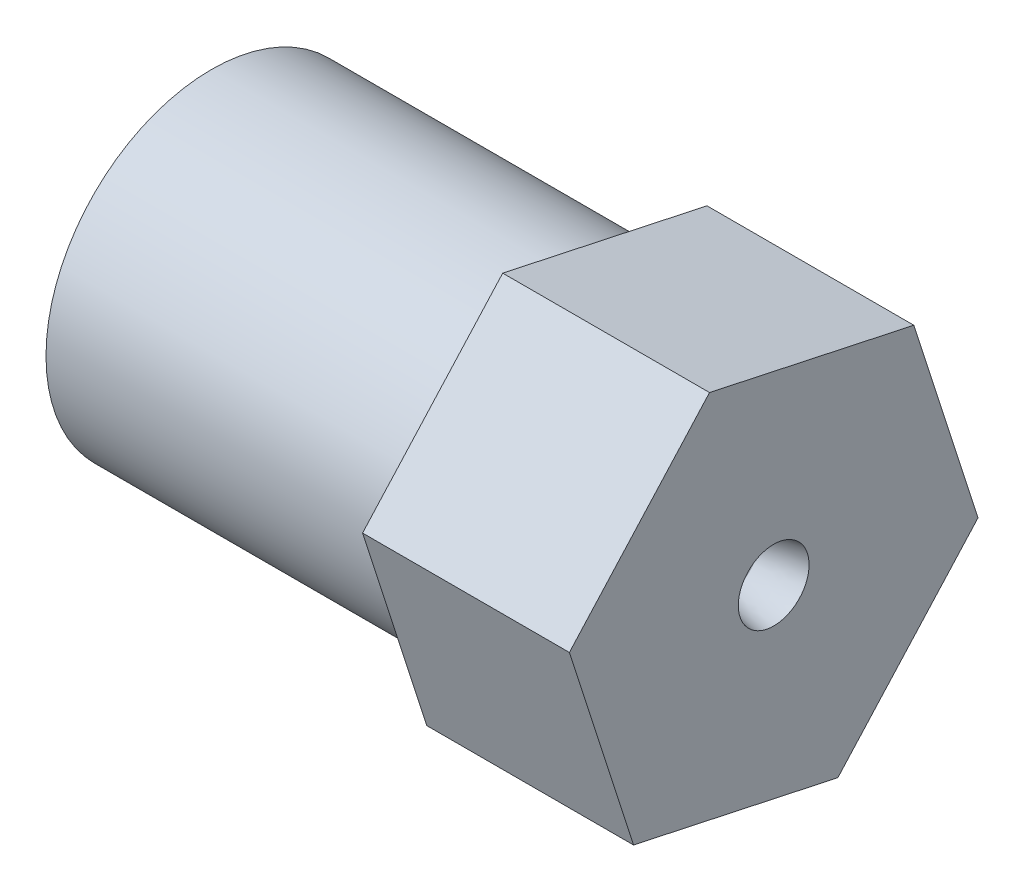
ISO-10303-21;
HEADER;
FILE_DESCRIPTION(('STEP AP214'),'2;1');
FILE_NAME('part.step','',(''),(''),'','','');
FILE_SCHEMA(('AUTOMOTIVE_DESIGN { 1 0 10303 214 1 1 1 1 }'));
ENDSEC;
DATA;
#1=APPLICATION_CONTEXT('core data for automotive mechanical design processes');
#2=APPLICATION_PROTOCOL_DEFINITION('international standard','automotive_design',2000,#1);
#3=PRODUCT_CONTEXT('',#1,'mechanical');
#4=PRODUCT('Part','Part','',(#3));
#5=PRODUCT_RELATED_PRODUCT_CATEGORY('part','',(#4));
#6=PRODUCT_DEFINITION_FORMATION('','',#4);
#7=PRODUCT_DEFINITION_CONTEXT('part definition',#1,'design');
#8=PRODUCT_DEFINITION('design','',#6,#7);
#9=PRODUCT_DEFINITION_SHAPE('','',#8);
#10=(LENGTH_UNIT() NAMED_UNIT(*) SI_UNIT(.MILLI.,.METRE.));
#11=(NAMED_UNIT(*) PLANE_ANGLE_UNIT() SI_UNIT($,.RADIAN.));
#12=(NAMED_UNIT(*) SI_UNIT($,.STERADIAN.) SOLID_ANGLE_UNIT());
#13=UNCERTAINTY_MEASURE_WITH_UNIT(LENGTH_MEASURE(1.E-05),#10,'distance_accuracy_value','');
#14=(GEOMETRIC_REPRESENTATION_CONTEXT(3) GLOBAL_UNCERTAINTY_ASSIGNED_CONTEXT((#13)) GLOBAL_UNIT_ASSIGNED_CONTEXT((#10,
#11,#12)) REPRESENTATION_CONTEXT('',''));
#15=CARTESIAN_POINT('',(0.,0.,0.));
#16=DIRECTION('',(0.,0.,1.));
#17=DIRECTION('',(1.,0.,0.));
#18=AXIS2_PLACEMENT_3D('',#15,#16,#17);
#19=CARTESIAN_POINT('',(0.,0.,0.));
#20=DIRECTION('',(-1.,0.,0.));
#21=DIRECTION('',(0.,0.,1.));
#22=AXIS2_PLACEMENT_3D('',#19,#20,#21);
#23=CYLINDRICAL_SURFACE('',#22,10.16);
#24=CARTESIAN_POINT('',(-10.5601197960547,0.,0.));
#25=DIRECTION('',(1.,0.,0.));
#26=DIRECTION('',(0.,0.,-1.));
#27=AXIS2_PLACEMENT_3D('',#24,#25,#26);
#28=CIRCLE('',#27,10.16);
#29=CARTESIAN_POINT('',(-10.5601197960547,0.,-10.16));
#30=VERTEX_POINT('',#29);
#31=EDGE_CURVE('E11',#30,#30,#28,.F.);
#32=ORIENTED_EDGE('',*,*,#31,.T.);
#33=EDGE_LOOP('',(#32));
#34=FACE_BOUND('',#33,.T.);
#35=CARTESIAN_POINT('',(-31.75,0.,0.));
#36=DIRECTION('',(-1.,0.,0.));
#37=DIRECTION('',(0.,0.,1.));
#38=AXIS2_PLACEMENT_3D('',#35,#36,#37);
#39=CIRCLE('',#38,10.16);
#40=CARTESIAN_POINT('',(-31.75,0.,10.16));
#41=VERTEX_POINT('',#40);
#42=EDGE_CURVE('E227',#41,#41,#39,.T.);
#43=ORIENTED_EDGE('',*,*,#42,.F.);
#44=EDGE_LOOP('',(#43));
#45=FACE_BOUND('',#44,.T.);
#46=ADVANCED_FACE('F39',(#34,#45),#23,.T.);
#47=CARTESIAN_POINT('',(0.,0.,0.));
#48=DIRECTION('',(-1.,0.,0.));
#49=DIRECTION('',(0.,0.,1.));
#50=AXIS2_PLACEMENT_3D('',#47,#48,#49);
#51=TOROIDAL_SURFACE('',#50,3.75,2.25);
#52=CARTESIAN_POINT('',(0.,0.,0.));
#53=DIRECTION('',(-1.,0.,0.));
#54=DIRECTION('',(0.,0.,1.));
#55=AXIS2_PLACEMENT_3D('',#52,#53,#54);
#56=CIRCLE('',#55,1.49999999991984);
#57=CARTESIAN_POINT('',(0.,0.,1.49999999991984));
#58=VERTEX_POINT('',#57);
#59=EDGE_CURVE('E179',#58,#58,#56,.T.);
#60=ORIENTED_EDGE('',*,*,#59,.F.);
#61=EDGE_LOOP('',(#60));
#62=FACE_BOUND('',#61,.T.);
#63=CARTESIAN_POINT('',(-1.59099025766971,0.,0.));
#64=DIRECTION('',(-1.,0.,0.));
#65=DIRECTION('',(0.,0.,1.));
#66=AXIS2_PLACEMENT_3D('',#63,#64,#65);
#67=CIRCLE('',#66,2.15900974233025);
#68=CARTESIAN_POINT('',(-1.59099025766971,0.,2.15900974233025));
#69=VERTEX_POINT('',#68);
#70=EDGE_CURVE('E144',#69,#69,#67,.T.);
#71=ORIENTED_EDGE('',*,*,#70,.T.);
#72=EDGE_LOOP('',(#71));
#73=FACE_BOUND('',#72,.T.);
#74=ADVANCED_FACE('F168',(#62,#73),#51,.T.);
#75=CARTESIAN_POINT('',(0.,0.,0.));
#76=DIRECTION('',(-1.,0.,0.));
#77=DIRECTION('',(0.,0.,1.));
#78=AXIS2_PLACEMENT_3D('',#75,#76,#77);
#79=TOROIDAL_SURFACE('',#78,2.1,0.600000000080161);
#80=CARTESIAN_POINT('',(0.205212086614726,0.,0.));
#81=DIRECTION('',(-1.,0.,0.));
#82=DIRECTION('',(0.,0.,1.));
#83=AXIS2_PLACEMENT_3D('',#80,#81,#82);
#84=CIRCLE('',#83,1.5361844276443);
#85=CARTESIAN_POINT('',(0.205212086614726,0.,1.5361844276443));
#86=VERTEX_POINT('',#85);
#87=EDGE_CURVE('E233',#86,#86,#84,.T.);
#88=ORIENTED_EDGE('',*,*,#87,.F.);
#89=EDGE_LOOP('',(#88));
#90=FACE_BOUND('',#89,.T.);
#91=ORIENTED_EDGE('',*,*,#59,.T.);
#92=EDGE_LOOP('',(#91));
#93=FACE_BOUND('',#92,.T.);
#94=ADVANCED_FACE('F164',(#90,#93),#79,.T.);
#95=CARTESIAN_POINT('',(337343.343526131,-941393.375211265,0.));
#96=CARTESIAN_POINT('',(-342019.938120508,939694.156967815,0.));
#97=CARTESIAN_POINT('',(346697.353563229,-937988.793986656,0.));
#98=B_SPLINE_CURVE_WITH_KNOTS('',2,(#95,#96,#97),.UNSPECIFIED.,.F.,.F.,(3,3),(0.,1.),.UNSPECIFIED.);
#99=CARTESIAN_POINT('',(0.,0.,0.));
#100=DIRECTION('',(-1.,0.,0.));
#101=AXIS1_PLACEMENT('',#99,#100);
#102=SURFACE_OF_REVOLUTION('',#98,#101);
#103=CARTESIAN_POINT('',(2.77488020377942,0.,0.));
#104=DIRECTION('',(-1.,0.,0.));
#105=DIRECTION('',(0.,0.,1.));
#106=AXIS2_PLACEMENT_3D('',#103,#104,#105);
#107=CIRCLE('',#106,2.17370651192842);
#108=CARTESIAN_POINT('',(2.77488020377942,0.,2.17370651192842));
#109=VERTEX_POINT('',#108);
#110=EDGE_CURVE('E230',#109,#109,#107,.T.);
#111=ORIENTED_EDGE('',*,*,#110,.F.);
#112=EDGE_LOOP('',(#111));
#113=FACE_BOUND('',#112,.T.);
#114=ORIENTED_EDGE('',*,*,#87,.T.);
#115=EDGE_LOOP('',(#114));
#116=FACE_BOUND('',#115,.T.);
#117=ADVANCED_FACE('F159',(#113,#116),#102,.T.);
#118=CARTESIAN_POINT('',(2.7748802039453,10.16,0.));
#119=DIRECTION('',(-1.,0.,0.));
#120=DIRECTION('',(0.,0.,1.));
#121=AXIS2_PLACEMENT_3D('',#118,#119,#120);
#122=PLANE('',#121);
#123=ORIENTED_EDGE('',*,*,#110,.T.);
#124=EDGE_LOOP('',(#123));
#125=FACE_BOUND('',#124,.T.);
#126=DIRECTION('',(0.,-0.951681663898051,-0.307086324345838));
#127=VECTOR('',#126,1.);
#128=CARTESIAN_POINT('',(2.7748802039453,-3.41249677929312,10.5755624900671));
#129=LINE('',#128,#127);
#130=CARTESIAN_POINT('',(2.7748802039453,2.69330707117882,12.5457684242007));
#131=VERTEX_POINT('',#130);
#132=CARTESIAN_POINT('',(2.7748802039453,-9.51830062976507,8.60535655593348));
#133=VERTEX_POINT('',#132);
#134=EDGE_CURVE('E127',#131,#133,#129,.T.);
#135=ORIENTED_EDGE('',*,*,#134,.T.);
#136=DIRECTION('',(0.,-0.209896273910742,-0.977723659424475));
#137=VECTOR('',#136,1.);
#138=CARTESIAN_POINT('',(2.7748802039453,-10.8649541653545,2.33247234383312));
#139=LINE('',#138,#137);
#140=CARTESIAN_POINT('',(2.7748802039453,-12.2116077009439,-3.94041186826723));
#141=VERTEX_POINT('',#140);
#142=EDGE_CURVE('E130',#133,#141,#139,.T.);
#143=ORIENTED_EDGE('',*,*,#142,.T.);
#144=DIRECTION('',(0.,0.741785389987309,-0.670637335078637));
#145=VECTOR('',#144,1.);
#146=CARTESIAN_POINT('',(2.7748802039453,-7.45245738606136,-8.24309014623397));
#147=LINE('',#146,#145);
#148=CARTESIAN_POINT('',(2.7748802039453,-2.69330707117882,-12.5457684242007));
#149=VERTEX_POINT('',#148);
#150=EDGE_CURVE('E133',#141,#149,#147,.T.);
#151=ORIENTED_EDGE('',*,*,#150,.T.);
#152=DIRECTION('',(0.,0.951681663898051,0.307086324345838));
#153=VECTOR('',#152,1.);
#154=CARTESIAN_POINT('',(2.7748802039453,3.41249677929312,-10.5755624900671));
#155=LINE('',#154,#153);
#156=CARTESIAN_POINT('',(2.7748802039453,9.51830062976506,-8.60535655593348));
#157=VERTEX_POINT('',#156);
#158=EDGE_CURVE('E136',#149,#157,#155,.T.);
#159=ORIENTED_EDGE('',*,*,#158,.T.);
#160=DIRECTION('',(0.,0.209896273910742,0.977723659424475));
#161=VECTOR('',#160,1.);
#162=CARTESIAN_POINT('',(2.7748802039453,10.8649541653545,-2.33247234383312));
#163=LINE('',#162,#161);
#164=CARTESIAN_POINT('',(2.7748802039453,12.2116077009439,3.94041186826724));
#165=VERTEX_POINT('',#164);
#166=EDGE_CURVE('E104',#157,#165,#163,.T.);
#167=ORIENTED_EDGE('',*,*,#166,.T.);
#168=DIRECTION('',(0.,-0.741785389987309,0.670637335078637));
#169=VECTOR('',#168,1.);
#170=CARTESIAN_POINT('',(2.7748802039453,7.45245738606136,8.24309014623397));
#171=LINE('',#170,#169);
#172=EDGE_CURVE('E139',#165,#131,#171,.T.);
#173=ORIENTED_EDGE('',*,*,#172,.T.);
#174=EDGE_LOOP('',(#135,#143,#151,#159,#167,#173));
#175=FACE_BOUND('',#174,.T.);
#176=ADVANCED_FACE('F163',(#125,#175),#122,.F.);
#177=CARTESIAN_POINT('',(-31.75,10.16,0.));
#178=DIRECTION('',(1.,0.,0.));
#179=DIRECTION('',(0.,0.,-1.));
#180=AXIS2_PLACEMENT_3D('',#177,#178,#179);
#181=PLANE('',#180);
#182=CARTESIAN_POINT('',(-31.75,0.,0.));
#183=DIRECTION('',(-1.,0.,0.));
#184=DIRECTION('',(0.,0.,1.));
#185=AXIS2_PLACEMENT_3D('',#182,#183,#184);
#186=CIRCLE('',#185,8.6614);
#187=CARTESIAN_POINT('',(-31.75,0.,8.6614));
#188=VERTEX_POINT('',#187);
#189=EDGE_CURVE('E224',#188,#188,#186,.T.);
#190=ORIENTED_EDGE('',*,*,#189,.F.);
#191=EDGE_LOOP('',(#190));
#192=FACE_BOUND('',#191,.T.);
#193=ORIENTED_EDGE('',*,*,#42,.T.);
#194=EDGE_LOOP('',(#193));
#195=FACE_BOUND('',#194,.T.);
#196=ADVANCED_FACE('F251',(#192,#195),#181,.F.);
#197=CARTESIAN_POINT('',(-31.115,0.,0.));
#198=DIRECTION('',(-1.,0.,0.));
#199=DIRECTION('',(0.,0.,1.));
#200=AXIS2_PLACEMENT_3D('',#197,#198,#199);
#201=TOROIDAL_SURFACE('',#200,8.6614,0.635);
#202=CARTESIAN_POINT('',(-31.115,0.,0.));
#203=DIRECTION('',(-1.,0.,0.));
#204=DIRECTION('',(0.,0.,1.));
#205=AXIS2_PLACEMENT_3D('',#202,#203,#204);
#206=CIRCLE('',#205,8.02639999999999);
#207=CARTESIAN_POINT('',(-31.115,0.,8.02639999999999));
#208=VERTEX_POINT('',#207);
#209=EDGE_CURVE('E221',#208,#208,#206,.T.);
#210=ORIENTED_EDGE('',*,*,#209,.F.);
#211=EDGE_LOOP('',(#210));
#212=FACE_BOUND('',#211,.T.);
#213=ORIENTED_EDGE('',*,*,#189,.T.);
#214=EDGE_LOOP('',(#213));
#215=FACE_BOUND('',#214,.T.);
#216=ADVANCED_FACE('F253',(#212,#215),#201,.T.);
#217=CARTESIAN_POINT('',(0.,0.,0.));
#218=DIRECTION('',(-1.,0.,0.));
#219=DIRECTION('',(0.,0.,1.));
#220=AXIS2_PLACEMENT_3D('',#217,#218,#219);
#221=CYLINDRICAL_SURFACE('',#220,8.02639999999999);
#222=CARTESIAN_POINT('',(-25.019,0.,0.));
#223=DIRECTION('',(-1.,0.,0.));
#224=DIRECTION('',(0.,0.,1.));
#225=AXIS2_PLACEMENT_3D('',#222,#223,#224);
#226=CIRCLE('',#225,8.02639999999999);
#227=CARTESIAN_POINT('',(-25.019,0.,8.02639999999999));
#228=VERTEX_POINT('',#227);
#229=EDGE_CURVE('E218',#228,#228,#226,.T.);
#230=ORIENTED_EDGE('',*,*,#229,.F.);
#231=EDGE_LOOP('',(#230));
#232=FACE_BOUND('',#231,.T.);
#233=ORIENTED_EDGE('',*,*,#209,.T.);
#234=EDGE_LOOP('',(#233));
#235=FACE_BOUND('',#234,.T.);
#236=ADVANCED_FACE('F260',(#232,#235),#221,.F.);
#237=CARTESIAN_POINT('',(-25.019,0.,0.));
#238=DIRECTION('',(-1.,0.,0.));
#239=DIRECTION('',(0.,0.,1.));
#240=AXIS2_PLACEMENT_3D('',#237,#238,#239);
#241=TOROIDAL_SURFACE('',#240,7.89939999999999,0.127);
#242=CARTESIAN_POINT('',(-24.892,0.,0.));
#243=DIRECTION('',(-1.,0.,0.));
#244=DIRECTION('',(0.,0.,1.));
#245=AXIS2_PLACEMENT_3D('',#242,#243,#244);
#246=CIRCLE('',#245,7.89939999999999);
#247=CARTESIAN_POINT('',(-24.892,0.,7.89939999999999));
#248=VERTEX_POINT('',#247);
#249=EDGE_CURVE('E215',#248,#248,#246,.T.);
#250=ORIENTED_EDGE('',*,*,#249,.F.);
#251=EDGE_LOOP('',(#250));
#252=FACE_BOUND('',#251,.T.);
#253=ORIENTED_EDGE('',*,*,#229,.T.);
#254=EDGE_LOOP('',(#253));
#255=FACE_BOUND('',#254,.T.);
#256=ADVANCED_FACE('F268',(#252,#255),#241,.F.);
#257=CARTESIAN_POINT('',(-24.892,6.9469,0.));
#258=DIRECTION('',(1.,0.,0.));
#259=DIRECTION('',(0.,0.,-1.));
#260=AXIS2_PLACEMENT_3D('',#257,#258,#259);
#261=PLANE('',#260);
#262=CARTESIAN_POINT('',(-24.892,0.,0.));
#263=DIRECTION('',(-1.,0.,0.));
#264=DIRECTION('',(0.,0.,1.));
#265=AXIS2_PLACEMENT_3D('',#262,#263,#264);
#266=CIRCLE('',#265,6.9469);
#267=CARTESIAN_POINT('',(-24.892,0.,6.9469));
#268=VERTEX_POINT('',#267);
#269=EDGE_CURVE('E212',#268,#268,#266,.T.);
#270=ORIENTED_EDGE('',*,*,#269,.F.);
#271=EDGE_LOOP('',(#270));
#272=FACE_BOUND('',#271,.T.);
#273=ORIENTED_EDGE('',*,*,#249,.T.);
#274=EDGE_LOOP('',(#273));
#275=FACE_BOUND('',#274,.T.);
#276=ADVANCED_FACE('F272',(#272,#275),#261,.F.);
#277=CARTESIAN_POINT('',(0.,0.,0.));
#278=DIRECTION('',(-1.,0.,0.));
#279=DIRECTION('',(0.,0.,1.));
#280=AXIS2_PLACEMENT_3D('',#277,#278,#279);
#281=CYLINDRICAL_SURFACE('',#280,6.9469);
#282=CARTESIAN_POINT('',(-20.066,0.,0.));
#283=DIRECTION('',(-1.,0.,0.));
#284=DIRECTION('',(0.,0.,1.));
#285=AXIS2_PLACEMENT_3D('',#282,#283,#284);
#286=CIRCLE('',#285,6.9469);
#287=CARTESIAN_POINT('',(-20.066,0.,6.9469));
#288=VERTEX_POINT('',#287);
#289=EDGE_CURVE('E209',#288,#288,#286,.T.);
#290=ORIENTED_EDGE('',*,*,#289,.F.);
#291=EDGE_LOOP('',(#290));
#292=FACE_BOUND('',#291,.T.);
#293=ORIENTED_EDGE('',*,*,#269,.T.);
#294=EDGE_LOOP('',(#293));
#295=FACE_BOUND('',#294,.T.);
#296=ADVANCED_FACE('F276',(#292,#295),#281,.F.);
#297=CARTESIAN_POINT('',(-20.066,0.,0.));
#298=DIRECTION('',(-1.,0.,0.));
#299=DIRECTION('',(0.,0.,1.));
#300=AXIS2_PLACEMENT_3D('',#297,#298,#299);
#301=TOROIDAL_SURFACE('',#300,6.8199,0.127);
#302=CARTESIAN_POINT('',(-19.939,0.,0.));
#303=DIRECTION('',(-1.,0.,0.));
#304=DIRECTION('',(0.,0.,1.));
#305=AXIS2_PLACEMENT_3D('',#302,#303,#304);
#306=CIRCLE('',#305,6.8199);
#307=CARTESIAN_POINT('',(-19.939,0.,6.8199));
#308=VERTEX_POINT('',#307);
#309=EDGE_CURVE('E206',#308,#308,#306,.T.);
#310=ORIENTED_EDGE('',*,*,#309,.F.);
#311=EDGE_LOOP('',(#310));
#312=FACE_BOUND('',#311,.T.);
#313=ORIENTED_EDGE('',*,*,#289,.T.);
#314=EDGE_LOOP('',(#313));
#315=FACE_BOUND('',#314,.T.);
#316=ADVANCED_FACE('F280',(#312,#315),#301,.F.);
#317=CARTESIAN_POINT('',(-19.939,5.46100000000001,0.));
#318=DIRECTION('',(1.,0.,0.));
#319=DIRECTION('',(0.,0.,-1.));
#320=AXIS2_PLACEMENT_3D('',#317,#318,#319);
#321=PLANE('',#320);
#322=CARTESIAN_POINT('',(-19.939,0.,0.));
#323=DIRECTION('',(-1.,0.,0.));
#324=DIRECTION('',(0.,0.,1.));
#325=AXIS2_PLACEMENT_3D('',#322,#323,#324);
#326=CIRCLE('',#325,5.46100000000001);
#327=CARTESIAN_POINT('',(-19.939,0.,5.46100000000001));
#328=VERTEX_POINT('',#327);
#329=EDGE_CURVE('E203',#328,#328,#326,.T.);
#330=ORIENTED_EDGE('',*,*,#329,.F.);
#331=EDGE_LOOP('',(#330));
#332=FACE_BOUND('',#331,.T.);
#333=ORIENTED_EDGE('',*,*,#309,.T.);
#334=EDGE_LOOP('',(#333));
#335=FACE_BOUND('',#334,.T.);
#336=ADVANCED_FACE('F284',(#332,#335),#321,.F.);
#337=CARTESIAN_POINT('',(-19.304,0.,0.));
#338=DIRECTION('',(-1.,0.,0.));
#339=DIRECTION('',(0.,0.,1.));
#340=AXIS2_PLACEMENT_3D('',#337,#338,#339);
#341=TOROIDAL_SURFACE('',#340,5.461,0.635);
#342=CARTESIAN_POINT('',(-19.304,0.,0.));
#343=DIRECTION('',(-1.,0.,0.));
#344=DIRECTION('',(0.,0.,1.));
#345=AXIS2_PLACEMENT_3D('',#342,#343,#344);
#346=CIRCLE('',#345,4.826);
#347=CARTESIAN_POINT('',(-19.304,0.,4.826));
#348=VERTEX_POINT('',#347);
#349=EDGE_CURVE('E200',#348,#348,#346,.T.);
#350=ORIENTED_EDGE('',*,*,#349,.F.);
#351=EDGE_LOOP('',(#350));
#352=FACE_BOUND('',#351,.T.);
#353=ORIENTED_EDGE('',*,*,#329,.T.);
#354=EDGE_LOOP('',(#353));
#355=FACE_BOUND('',#354,.T.);
#356=ADVANCED_FACE('F288',(#352,#355),#341,.T.);
#357=CARTESIAN_POINT('',(0.,0.,0.));
#358=DIRECTION('',(-1.,0.,0.));
#359=DIRECTION('',(0.,0.,1.));
#360=AXIS2_PLACEMENT_3D('',#357,#358,#359);
#361=CYLINDRICAL_SURFACE('',#360,4.826);
#362=CARTESIAN_POINT('',(-13.589,0.,0.));
#363=DIRECTION('',(-1.,0.,0.));
#364=DIRECTION('',(0.,0.,1.));
#365=AXIS2_PLACEMENT_3D('',#362,#363,#364);
#366=CIRCLE('',#365,4.826);
#367=CARTESIAN_POINT('',(-13.589,0.,4.826));
#368=VERTEX_POINT('',#367);
#369=EDGE_CURVE('E197',#368,#368,#366,.T.);
#370=ORIENTED_EDGE('',*,*,#369,.F.);
#371=EDGE_LOOP('',(#370));
#372=FACE_BOUND('',#371,.T.);
#373=ORIENTED_EDGE('',*,*,#349,.T.);
#374=EDGE_LOOP('',(#373));
#375=FACE_BOUND('',#374,.T.);
#376=ADVANCED_FACE('F292',(#372,#375),#361,.F.);
#377=CARTESIAN_POINT('',(-13.589,0.,0.));
#378=DIRECTION('',(-1.,0.,0.));
#379=DIRECTION('',(0.,0.,1.));
#380=AXIS2_PLACEMENT_3D('',#377,#378,#379);
#381=TOROIDAL_SURFACE('',#380,4.699,0.127);
#382=CARTESIAN_POINT('',(-13.462,0.,0.));
#383=DIRECTION('',(-1.,0.,0.));
#384=DIRECTION('',(0.,0.,1.));
#385=AXIS2_PLACEMENT_3D('',#382,#383,#384);
#386=CIRCLE('',#385,4.699);
#387=CARTESIAN_POINT('',(-13.462,0.,4.699));
#388=VERTEX_POINT('',#387);
#389=EDGE_CURVE('E194',#388,#388,#386,.T.);
#390=ORIENTED_EDGE('',*,*,#389,.F.);
#391=EDGE_LOOP('',(#390));
#392=FACE_BOUND('',#391,.T.);
#393=ORIENTED_EDGE('',*,*,#369,.T.);
#394=EDGE_LOOP('',(#393));
#395=FACE_BOUND('',#394,.T.);
#396=ADVANCED_FACE('F296',(#392,#395),#381,.F.);
#397=CARTESIAN_POINT('',(-13.462,4.445,0.));
#398=DIRECTION('',(1.,0.,0.));
#399=DIRECTION('',(0.,0.,-1.));
#400=AXIS2_PLACEMENT_3D('',#397,#398,#399);
#401=PLANE('',#400);
#402=CARTESIAN_POINT('',(-13.462,0.,0.));
#403=DIRECTION('',(-1.,0.,0.));
#404=DIRECTION('',(0.,0.,1.));
#405=AXIS2_PLACEMENT_3D('',#402,#403,#404);
#406=CIRCLE('',#405,4.445);
#407=CARTESIAN_POINT('',(-13.462,0.,4.445));
#408=VERTEX_POINT('',#407);
#409=EDGE_CURVE('E189',#408,#408,#406,.T.);
#410=ORIENTED_EDGE('',*,*,#409,.F.);
#411=EDGE_LOOP('',(#410));
#412=FACE_BOUND('',#411,.T.);
#413=ORIENTED_EDGE('',*,*,#389,.T.);
#414=EDGE_LOOP('',(#413));
#415=FACE_BOUND('',#414,.T.);
#416=ADVANCED_FACE('F300',(#412,#415),#401,.F.);
#417=CARTESIAN_POINT('',(0.,0.,0.));
#418=DIRECTION('',(-1.,0.,0.));
#419=DIRECTION('',(0.,0.,1.));
#420=AXIS2_PLACEMENT_3D('',#417,#418,#419);
#421=CYLINDRICAL_SURFACE('',#420,4.445);
#422=CARTESIAN_POINT('',(-5.19210857587407,0.,0.));
#423=DIRECTION('',(-1.,0.,0.));
#424=DIRECTION('',(0.,0.,1.));
#425=AXIS2_PLACEMENT_3D('',#422,#423,#424);
#426=CIRCLE('',#425,4.445);
#427=CARTESIAN_POINT('',(-5.19210857587407,0.,4.445));
#428=VERTEX_POINT('',#427);
#429=EDGE_CURVE('E185',#428,#428,#426,.T.);
#430=ORIENTED_EDGE('',*,*,#429,.F.);
#431=EDGE_LOOP('',(#430));
#432=FACE_BOUND('',#431,.T.);
#433=ORIENTED_EDGE('',*,*,#409,.T.);
#434=EDGE_LOOP('',(#433));
#435=FACE_BOUND('',#434,.T.);
#436=ADVANCED_FACE('F304',(#432,#435),#421,.F.);
#437=CARTESIAN_POINT('',(-5.19210857587407,0.,0.));
#438=DIRECTION('',(-1.,0.,0.));
#439=DIRECTION('',(0.,0.,1.));
#440=AXIS2_PLACEMENT_3D('',#437,#438,#439);
#441=DEGENERATE_TOROIDAL_SURFACE('',#440,1.27,3.175,.T.);
#442=CARTESIAN_POINT('',(-2.94704454560681,0.,0.));
#443=DIRECTION('',(-1.,0.,0.));
#444=DIRECTION('',(0.,0.,1.));
#445=AXIS2_PLACEMENT_3D('',#442,#443,#444);
#446=CIRCLE('',#445,3.51506403026731);
#447=CARTESIAN_POINT('',(-2.94704454560681,0.,3.51506403026731));
#448=VERTEX_POINT('',#447);
#449=EDGE_CURVE('E183',#448,#448,#446,.T.);
#450=ORIENTED_EDGE('',*,*,#449,.F.);
#451=EDGE_LOOP('',(#450));
#452=FACE_BOUND('',#451,.T.);
#453=ORIENTED_EDGE('',*,*,#429,.T.);
#454=EDGE_LOOP('',(#453));
#455=FACE_BOUND('',#454,.T.);
#456=ADVANCED_FACE('F308',(#452,#455),#441,.F.);
#457=CARTESIAN_POINT('',(-2.94704454560681,0.,0.));
#458=DIRECTION('',(-1.,0.,0.));
#459=DIRECTION('',(0.,0.,1.));
#460=AXIS2_PLACEMENT_3D('',#457,#458,#459);
#461=CONICAL_SURFACE('',#460,3.51506403026731,0.785398163397437);
#462=ORIENTED_EDGE('',*,*,#70,.F.);
#463=EDGE_LOOP('',(#462));
#464=FACE_BOUND('',#463,.T.);
#465=ORIENTED_EDGE('',*,*,#449,.T.);
#466=EDGE_LOOP('',(#465));
#467=FACE_BOUND('',#466,.T.);
#468=ADVANCED_FACE('F312',(#464,#467),#461,.F.);
#469=CARTESIAN_POINT('',(-9.9251197960547,-3.41249677929312,10.5755624900671));
#470=DIRECTION('',(0.,-0.307086324345838,0.951681663898051));
#471=DIRECTION('',(0.,-0.951681663898051,-0.307086324345838));
#472=AXIS2_PLACEMENT_3D('',#469,#470,#471);
#473=PLANE('',#472);
#474=ORIENTED_EDGE('',*,*,#134,.F.);
#475=DIRECTION('',(1.,0.,0.));
#476=VECTOR('',#475,1.);
#477=CARTESIAN_POINT('',(-9.9251197960547,2.69330707117882,12.5457684242007));
#478=LINE('',#477,#476);
#479=CARTESIAN_POINT('',(-9.9251197960547,2.69330707117882,12.5457684242007));
#480=VERTEX_POINT('',#479);
#481=EDGE_CURVE('E56',#480,#131,#478,.T.);
#482=ORIENTED_EDGE('',*,*,#481,.F.);
#483=DIRECTION('',(0.,-0.951681663898051,-0.307086324345838));
#484=VECTOR('',#483,1.);
#485=CARTESIAN_POINT('',(-9.9251197960547,-3.41249677929312,10.5755624900671));
#486=LINE('',#485,#484);
#487=CARTESIAN_POINT('',(-9.9251197960547,-9.51830062976507,8.60535655593348));
#488=VERTEX_POINT('',#487);
#489=EDGE_CURVE('E142',#480,#488,#486,.T.);
#490=ORIENTED_EDGE('',*,*,#489,.T.);
#491=DIRECTION('',(1.,0.,0.));
#492=VECTOR('',#491,1.);
#493=CARTESIAN_POINT('',(-9.9251197960547,-9.51830062976507,8.60535655593348));
#494=LINE('',#493,#492);
#495=EDGE_CURVE('E91',#488,#133,#494,.T.);
#496=ORIENTED_EDGE('',*,*,#495,.T.);
#497=EDGE_LOOP('',(#474,#482,#490,#496));
#498=FACE_BOUND('',#497,.T.);
#499=ADVANCED_FACE('F316',(#498),#473,.T.);
#500=CARTESIAN_POINT('',(-9.9251197960547,7.45245738606136,8.24309014623397));
#501=DIRECTION('',(0.,0.670637335078637,0.741785389987309));
#502=DIRECTION('',(0.,-0.741785389987309,0.670637335078637));
#503=AXIS2_PLACEMENT_3D('',#500,#501,#502);
#504=PLANE('',#503);
#505=ORIENTED_EDGE('',*,*,#172,.F.);
#506=DIRECTION('',(1.,0.,0.));
#507=VECTOR('',#506,1.);
#508=CARTESIAN_POINT('',(-9.9251197960547,12.2116077009439,3.94041186826724));
#509=LINE('',#508,#507);
#510=CARTESIAN_POINT('',(-9.9251197960547,12.2116077009439,3.94041186826724));
#511=VERTEX_POINT('',#510);
#512=EDGE_CURVE('E79',#511,#165,#509,.T.);
#513=ORIENTED_EDGE('',*,*,#512,.F.);
#514=DIRECTION('',(0.,-0.741785389987309,0.670637335078637));
#515=VECTOR('',#514,1.);
#516=CARTESIAN_POINT('',(-9.9251197960547,7.45245738606136,8.24309014623397));
#517=LINE('',#516,#515);
#518=EDGE_CURVE('E117',#511,#480,#517,.T.);
#519=ORIENTED_EDGE('',*,*,#518,.T.);
#520=ORIENTED_EDGE('',*,*,#481,.T.);
#521=EDGE_LOOP('',(#505,#513,#519,#520));
#522=FACE_BOUND('',#521,.T.);
#523=ADVANCED_FACE('F319',(#522),#504,.T.);
#524=CARTESIAN_POINT('',(-9.9251197960547,10.8649541653545,-2.33247234383312));
#525=DIRECTION('',(0.,0.977723659424475,-0.209896273910742));
#526=DIRECTION('',(0.,0.209896273910742,0.977723659424475));
#527=AXIS2_PLACEMENT_3D('',#524,#525,#526);
#528=PLANE('',#527);
#529=ORIENTED_EDGE('',*,*,#166,.F.);
#530=DIRECTION('',(1.,0.,0.));
#531=VECTOR('',#530,1.);
#532=CARTESIAN_POINT('',(-9.9251197960547,9.51830062976506,-8.60535655593348));
#533=LINE('',#532,#531);
#534=CARTESIAN_POINT('',(-9.9251197960547,9.51830062976506,-8.60535655593348));
#535=VERTEX_POINT('',#534);
#536=EDGE_CURVE('E99',#535,#157,#533,.T.);
#537=ORIENTED_EDGE('',*,*,#536,.F.);
#538=DIRECTION('',(0.,0.209896273910742,0.977723659424475));
#539=VECTOR('',#538,1.);
#540=CARTESIAN_POINT('',(-9.9251197960547,10.8649541653545,-2.33247234383312));
#541=LINE('',#540,#539);
#542=EDGE_CURVE('E102',#535,#511,#541,.T.);
#543=ORIENTED_EDGE('',*,*,#542,.T.);
#544=ORIENTED_EDGE('',*,*,#512,.T.);
#545=EDGE_LOOP('',(#529,#537,#543,#544));
#546=FACE_BOUND('',#545,.T.);
#547=ADVANCED_FACE('F101',(#546),#528,.T.);
#548=CARTESIAN_POINT('',(-9.9251197960547,3.41249677929312,-10.5755624900671));
#549=DIRECTION('',(0.,0.307086324345838,-0.951681663898051));
#550=DIRECTION('',(0.,0.951681663898051,0.307086324345838));
#551=AXIS2_PLACEMENT_3D('',#548,#549,#550);
#552=PLANE('',#551);
#553=ORIENTED_EDGE('',*,*,#158,.F.);
#554=DIRECTION('',(1.,0.,0.));
#555=VECTOR('',#554,1.);
#556=CARTESIAN_POINT('',(-9.9251197960547,-2.69330707117882,-12.5457684242007));
#557=LINE('',#556,#555);
#558=CARTESIAN_POINT('',(-9.9251197960547,-2.69330707117882,-12.5457684242007));
#559=VERTEX_POINT('',#558);
#560=EDGE_CURVE('E109',#559,#149,#557,.T.);
#561=ORIENTED_EDGE('',*,*,#560,.F.);
#562=DIRECTION('',(0.,0.951681663898051,0.307086324345838));
#563=VECTOR('',#562,1.);
#564=CARTESIAN_POINT('',(-9.9251197960547,3.41249677929312,-10.5755624900671));
#565=LINE('',#564,#563);
#566=EDGE_CURVE('E115',#559,#535,#565,.T.);
#567=ORIENTED_EDGE('',*,*,#566,.T.);
#568=ORIENTED_EDGE('',*,*,#536,.T.);
#569=EDGE_LOOP('',(#553,#561,#567,#568));
#570=FACE_BOUND('',#569,.T.);
#571=ADVANCED_FACE('F119',(#570),#552,.T.);
#572=CARTESIAN_POINT('',(-9.9251197960547,-7.45245738606136,-8.24309014623397));
#573=DIRECTION('',(0.,-0.670637335078637,-0.741785389987309));
#574=DIRECTION('',(0.,0.741785389987309,-0.670637335078637));
#575=AXIS2_PLACEMENT_3D('',#572,#573,#574);
#576=PLANE('',#575);
#577=ORIENTED_EDGE('',*,*,#150,.F.);
#578=DIRECTION('',(1.,0.,0.));
#579=VECTOR('',#578,1.);
#580=CARTESIAN_POINT('',(-9.9251197960547,-12.2116077009439,-3.94041186826723));
#581=LINE('',#580,#579);
#582=CARTESIAN_POINT('',(-9.9251197960547,-12.2116077009439,-3.94041186826723));
#583=VERTEX_POINT('',#582);
#584=EDGE_CURVE('E147',#583,#141,#581,.T.);
#585=ORIENTED_EDGE('',*,*,#584,.F.);
#586=DIRECTION('',(0.,0.741785389987309,-0.670637335078637));
#587=VECTOR('',#586,1.);
#588=CARTESIAN_POINT('',(-9.9251197960547,-7.45245738606136,-8.24309014623397));
#589=LINE('',#588,#587);
#590=EDGE_CURVE('E120',#583,#559,#589,.T.);
#591=ORIENTED_EDGE('',*,*,#590,.T.);
#592=ORIENTED_EDGE('',*,*,#560,.T.);
#593=EDGE_LOOP('',(#577,#585,#591,#592));
#594=FACE_BOUND('',#593,.T.);
#595=ADVANCED_FACE('F322',(#594),#576,.T.);
#596=CARTESIAN_POINT('',(-9.9251197960547,-10.8649541653545,2.33247234383312));
#597=DIRECTION('',(0.,-0.977723659424475,0.209896273910742));
#598=DIRECTION('',(0.,-0.209896273910742,-0.977723659424475));
#599=AXIS2_PLACEMENT_3D('',#596,#597,#598);
#600=PLANE('',#599);
#601=ORIENTED_EDGE('',*,*,#142,.F.);
#602=ORIENTED_EDGE('',*,*,#495,.F.);
#603=DIRECTION('',(0.,-0.209896273910742,-0.977723659424475));
#604=VECTOR('',#603,1.);
#605=CARTESIAN_POINT('',(-9.9251197960547,-10.8649541653545,2.33247234383312));
#606=LINE('',#605,#604);
#607=EDGE_CURVE('E122',#488,#583,#606,.T.);
#608=ORIENTED_EDGE('',*,*,#607,.T.);
#609=ORIENTED_EDGE('',*,*,#584,.T.);
#610=EDGE_LOOP('',(#601,#602,#608,#609));
#611=FACE_BOUND('',#610,.T.);
#612=ADVANCED_FACE('F245',(#611),#600,.T.);
#613=CARTESIAN_POINT('',(-9.9251197960547,0.,0.));
#614=DIRECTION('',(1.,0.,0.));
#615=DIRECTION('',(0.,0.,-1.));
#616=AXIS2_PLACEMENT_3D('',#613,#614,#615);
#617=PLANE('',#616);
#618=CARTESIAN_POINT('',(-9.9251197960547,0.,0.));
#619=DIRECTION('',(1.,0.,0.));
#620=DIRECTION('',(0.,0.,-1.));
#621=AXIS2_PLACEMENT_3D('',#618,#619,#620);
#622=CIRCLE('',#621,10.795);
#623=CARTESIAN_POINT('',(-9.9251197960547,0.,-10.795));
#624=VERTEX_POINT('',#623);
#625=EDGE_CURVE('E48',#624,#624,#622,.T.);
#626=ORIENTED_EDGE('',*,*,#625,.T.);
#627=EDGE_LOOP('',(#626));
#628=FACE_BOUND('',#627,.T.);
#629=ORIENTED_EDGE('',*,*,#489,.F.);
#630=ORIENTED_EDGE('',*,*,#518,.F.);
#631=ORIENTED_EDGE('',*,*,#542,.F.);
#632=ORIENTED_EDGE('',*,*,#566,.F.);
#633=ORIENTED_EDGE('',*,*,#590,.F.);
#634=ORIENTED_EDGE('',*,*,#607,.F.);
#635=EDGE_LOOP('',(#629,#630,#631,#632,#633,#634));
#636=FACE_BOUND('',#635,.T.);
#637=ADVANCED_FACE('F113',(#628,#636),#617,.F.);
#638=CARTESIAN_POINT('',(-10.5601197960547,0.,0.));
#639=DIRECTION('',(1.,0.,0.));
#640=DIRECTION('',(0.,0.,-1.));
#641=AXIS2_PLACEMENT_3D('',#638,#639,#640);
#642=TOROIDAL_SURFACE('',#641,10.795,0.635);
#643=ORIENTED_EDGE('',*,*,#31,.F.);
#644=EDGE_LOOP('',(#643));
#645=FACE_BOUND('',#644,.T.);
#646=ORIENTED_EDGE('',*,*,#625,.F.);
#647=EDGE_LOOP('',(#646));
#648=FACE_BOUND('',#647,.T.);
#649=ADVANCED_FACE('F41',(#645,#648),#642,.F.);
#650=CLOSED_SHELL('',(#46,#74,#94,#117,#176,#196,#216,#236,#256,#276,#296,#316,#336,#356,#376,
#396,#416,#436,#456,#468,#499,#523,#547,#571,#595,#612,#637,#649));
#651=MANIFOLD_SOLID_BREP('B2',#650);
#652=ADVANCED_BREP_SHAPE_REPRESENTATION('',(#18,#651),#14);
#653=SHAPE_DEFINITION_REPRESENTATION(#9,#652);
ENDSEC;
END-ISO-10303-21;
